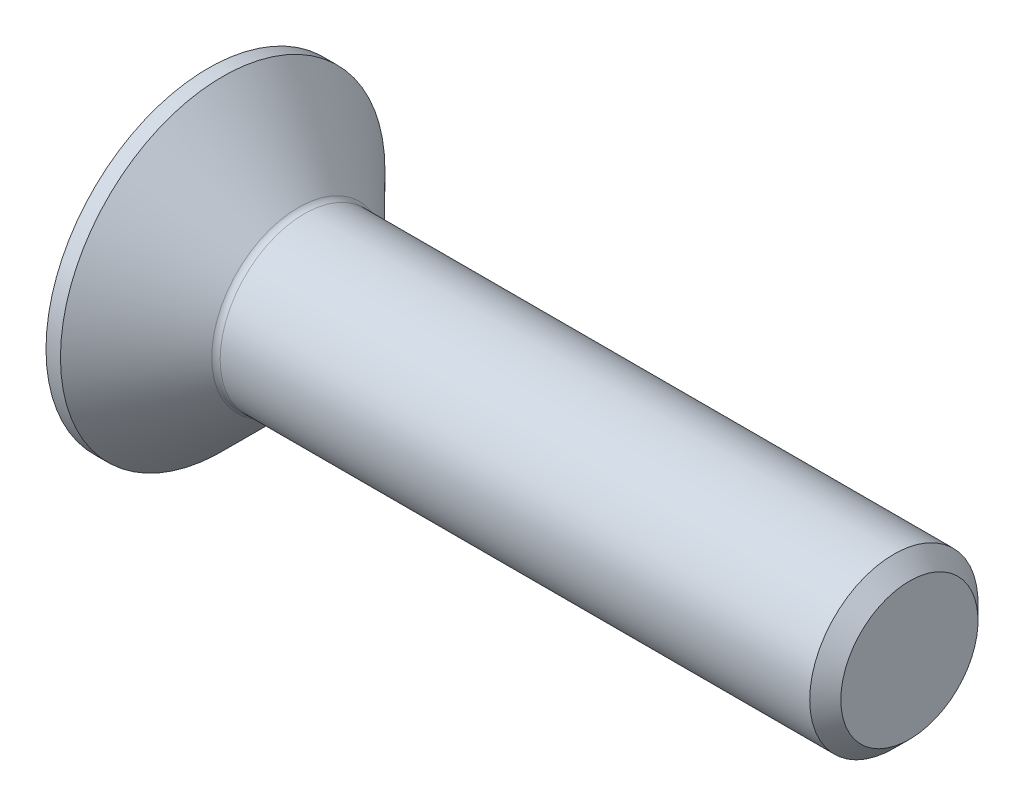
ISO-10303-21;
HEADER;
FILE_DESCRIPTION(('STEP AP214'),'2;1');
FILE_NAME('part.step','',(''),(''),'','','');
FILE_SCHEMA(('AUTOMOTIVE_DESIGN { 1 0 10303 214 1 1 1 1 }'));
ENDSEC;
DATA;
#1=APPLICATION_CONTEXT('core data for automotive mechanical design processes');
#2=APPLICATION_PROTOCOL_DEFINITION('international standard','automotive_design',2000,#1);
#3=PRODUCT_CONTEXT('',#1,'mechanical');
#4=PRODUCT('Part','Part','',(#3));
#5=PRODUCT_RELATED_PRODUCT_CATEGORY('part','',(#4));
#6=PRODUCT_DEFINITION_FORMATION('','',#4);
#7=PRODUCT_DEFINITION_CONTEXT('part definition',#1,'design');
#8=PRODUCT_DEFINITION('design','',#6,#7);
#9=PRODUCT_DEFINITION_SHAPE('','',#8);
#10=(LENGTH_UNIT() NAMED_UNIT(*) SI_UNIT(.MILLI.,.METRE.));
#11=(NAMED_UNIT(*) PLANE_ANGLE_UNIT() SI_UNIT($,.RADIAN.));
#12=(NAMED_UNIT(*) SI_UNIT($,.STERADIAN.) SOLID_ANGLE_UNIT());
#13=UNCERTAINTY_MEASURE_WITH_UNIT(LENGTH_MEASURE(1.E-05),#10,'distance_accuracy_value','');
#14=(GEOMETRIC_REPRESENTATION_CONTEXT(3) GLOBAL_UNCERTAINTY_ASSIGNED_CONTEXT((#13)) GLOBAL_UNIT_ASSIGNED_CONTEXT((#10,
#11,#12)) REPRESENTATION_CONTEXT('',''));
#15=CARTESIAN_POINT('',(0.,0.,0.));
#16=DIRECTION('',(0.,0.,1.));
#17=DIRECTION('',(1.,0.,0.));
#18=AXIS2_PLACEMENT_3D('',#15,#16,#17);
#19=CARTESIAN_POINT('',(0.,0.,0.));
#20=DIRECTION('',(-1.,0.,0.));
#21=DIRECTION('',(0.,0.,1.));
#22=AXIS2_PLACEMENT_3D('',#19,#20,#21);
#23=PLANE('',#22);
#24=CARTESIAN_POINT('',(0.,0.,0.));
#25=DIRECTION('',(-1.,0.,0.));
#26=DIRECTION('',(0.,0.,1.));
#27=AXIS2_PLACEMENT_3D('',#24,#25,#26);
#28=CIRCLE('',#27,5.785);
#29=CARTESIAN_POINT('',(0.,0.,5.785));
#30=VERTEX_POINT('',#29);
#31=EDGE_CURVE('E158',#30,#30,#28,.T.);
#32=ORIENTED_EDGE('',*,*,#31,.T.);
#33=EDGE_LOOP('',(#32));
#34=FACE_BOUND('',#33,.T.);
#35=DIRECTION('',(0.,-0.5,-0.866025403784439));
#36=VECTOR('',#35,1.);
#37=CARTESIAN_POINT('',(0.,-1.16047404107115,2.01));
#38=LINE('',#37,#36);
#39=CARTESIAN_POINT('',(0.,-1.16047404107115,2.01));
#40=VERTEX_POINT('',#39);
#41=CARTESIAN_POINT('',(0.,-2.32094808214229,0.));
#42=VERTEX_POINT('',#41);
#43=EDGE_CURVE('E120',#40,#42,#38,.T.);
#44=ORIENTED_EDGE('',*,*,#43,.T.);
#45=DIRECTION('',(0.,0.5,-0.866025403784439));
#46=VECTOR('',#45,1.);
#47=CARTESIAN_POINT('',(0.,-2.32094808214229,0.));
#48=LINE('',#47,#46);
#49=CARTESIAN_POINT('',(0.,-1.16047404107115,-2.01));
#50=VERTEX_POINT('',#49);
#51=EDGE_CURVE('E50',#42,#50,#48,.T.);
#52=ORIENTED_EDGE('',*,*,#51,.T.);
#53=DIRECTION('',(0.,1.,0.));
#54=VECTOR('',#53,1.);
#55=CARTESIAN_POINT('',(0.,-1.16047404107115,-2.01));
#56=LINE('',#55,#54);
#57=CARTESIAN_POINT('',(0.,1.16047404107115,-2.01));
#58=VERTEX_POINT('',#57);
#59=EDGE_CURVE('E135',#50,#58,#56,.T.);
#60=ORIENTED_EDGE('',*,*,#59,.T.);
#61=DIRECTION('',(0.,0.5,0.866025403784439));
#62=VECTOR('',#61,1.);
#63=CARTESIAN_POINT('',(0.,1.16047404107115,-2.01));
#64=LINE('',#63,#62);
#65=CARTESIAN_POINT('',(0.,2.32094808214229,0.));
#66=VERTEX_POINT('',#65);
#67=EDGE_CURVE('E271',#58,#66,#64,.T.);
#68=ORIENTED_EDGE('',*,*,#67,.T.);
#69=DIRECTION('',(0.,-0.5,0.866025403784439));
#70=VECTOR('',#69,1.);
#71=CARTESIAN_POINT('',(0.,2.32094808214229,0.));
#72=LINE('',#71,#70);
#73=CARTESIAN_POINT('',(0.,1.16047404107115,2.01));
#74=VERTEX_POINT('',#73);
#75=EDGE_CURVE('E274',#66,#74,#72,.T.);
#76=ORIENTED_EDGE('',*,*,#75,.T.);
#77=DIRECTION('',(0.,-1.,0.));
#78=VECTOR('',#77,1.);
#79=CARTESIAN_POINT('',(0.,1.16047404107115,2.01));
#80=LINE('',#79,#78);
#81=EDGE_CURVE('E277',#74,#40,#80,.T.);
#82=ORIENTED_EDGE('',*,*,#81,.T.);
#83=EDGE_LOOP('',(#44,#52,#60,#68,#76,#82));
#84=FACE_BOUND('',#83,.T.);
#85=ADVANCED_FACE('F35',(#34,#84),#23,.T.);
#86=CARTESIAN_POINT('',(0.,0.,0.));
#87=DIRECTION('',(-1.,0.,0.));
#88=DIRECTION('',(0.,0.,1.));
#89=AXIS2_PLACEMENT_3D('',#86,#87,#88);
#90=CYLINDRICAL_SURFACE('',#89,5.785);
#91=CARTESIAN_POINT('',(0.51500000000001,0.,0.));
#92=DIRECTION('',(-1.,0.,0.));
#93=DIRECTION('',(0.,0.,1.));
#94=AXIS2_PLACEMENT_3D('',#91,#92,#93);
#95=CIRCLE('',#94,5.785);
#96=CARTESIAN_POINT('',(0.51500000000001,0.,5.785));
#97=VERTEX_POINT('',#96);
#98=EDGE_CURVE('E155',#97,#97,#95,.T.);
#99=ORIENTED_EDGE('',*,*,#98,.T.);
#100=EDGE_LOOP('',(#99));
#101=FACE_BOUND('',#100,.T.);
#102=ORIENTED_EDGE('',*,*,#31,.F.);
#103=EDGE_LOOP('',(#102));
#104=FACE_BOUND('',#103,.T.);
#105=ADVANCED_FACE('F179',(#101,#104),#90,.T.);
#106=CARTESIAN_POINT('',(0.51500000000001,0.,0.));
#107=DIRECTION('',(-1.,0.,0.));
#108=DIRECTION('',(0.,0.,1.));
#109=AXIS2_PLACEMENT_3D('',#106,#107,#108);
#110=CONICAL_SURFACE('',#109,5.785,0.78539816339745);
#111=CARTESIAN_POINT('',(3.21213203435599,0.,0.));
#112=DIRECTION('',(-1.,0.,0.));
#113=DIRECTION('',(0.,0.,1.));
#114=AXIS2_PLACEMENT_3D('',#111,#112,#113);
#115=CIRCLE('',#114,3.08786796564401);
#116=CARTESIAN_POINT('',(3.21213203435599,0.,3.08786796564401));
#117=VERTEX_POINT('',#116);
#118=EDGE_CURVE('E43',#117,#117,#115,.T.);
#119=ORIENTED_EDGE('',*,*,#118,.T.);
#120=EDGE_LOOP('',(#119));
#121=FACE_BOUND('',#120,.T.);
#122=ORIENTED_EDGE('',*,*,#98,.F.);
#123=EDGE_LOOP('',(#122));
#124=FACE_BOUND('',#123,.T.);
#125=ADVANCED_FACE('F163',(#121,#124),#110,.T.);
#126=CARTESIAN_POINT('',(0.,0.,0.));
#127=DIRECTION('',(-1.,0.,0.));
#128=DIRECTION('',(0.,0.,1.));
#129=AXIS2_PLACEMENT_3D('',#126,#127,#128);
#130=CYLINDRICAL_SURFACE('',#129,2.99999999999997);
#131=CARTESIAN_POINT('',(3.42426406871195,0.,0.));
#132=DIRECTION('',(-1.,0.,0.));
#133=DIRECTION('',(0.,0.,1.));
#134=AXIS2_PLACEMENT_3D('',#131,#132,#133);
#135=CIRCLE('',#134,2.99999999999997);
#136=CARTESIAN_POINT('',(3.42426406871195,0.,2.99999999999997));
#137=VERTEX_POINT('',#136);
#138=EDGE_CURVE('E11',#137,#137,#135,.F.);
#139=ORIENTED_EDGE('',*,*,#138,.T.);
#140=EDGE_LOOP('',(#139));
#141=FACE_BOUND('',#140,.T.);
#142=CARTESIAN_POINT('',(24.4455,0.,0.));
#143=DIRECTION('',(-1.,0.,0.));
#144=DIRECTION('',(0.,0.,1.));
#145=AXIS2_PLACEMENT_3D('',#142,#143,#144);
#146=CIRCLE('',#145,2.99999999999995);
#147=CARTESIAN_POINT('',(24.4455,0.,2.99999999999995));
#148=VERTEX_POINT('',#147);
#149=EDGE_CURVE('E152',#148,#148,#146,.T.);
#150=ORIENTED_EDGE('',*,*,#149,.T.);
#151=EDGE_LOOP('',(#150));
#152=FACE_BOUND('',#151,.T.);
#153=ADVANCED_FACE('F190',(#141,#152),#130,.T.);
#154=CARTESIAN_POINT('',(25.,0.,0.));
#155=DIRECTION('',(-1.,0.,0.));
#156=DIRECTION('',(0.,0.,1.));
#157=AXIS2_PLACEMENT_3D('',#154,#155,#156);
#158=CONICAL_SURFACE('',#157,2.4455,0.785398163397361);
#159=ORIENTED_EDGE('',*,*,#149,.F.);
#160=EDGE_LOOP('',(#159));
#161=FACE_BOUND('',#160,.T.);
#162=CARTESIAN_POINT('',(25.,0.,0.));
#163=DIRECTION('',(-1.,0.,0.));
#164=DIRECTION('',(0.,0.,1.));
#165=AXIS2_PLACEMENT_3D('',#162,#163,#164);
#166=CIRCLE('',#165,2.4455);
#167=CARTESIAN_POINT('',(25.,0.,2.4455));
#168=VERTEX_POINT('',#167);
#169=EDGE_CURVE('E148',#168,#168,#166,.T.);
#170=ORIENTED_EDGE('',*,*,#169,.T.);
#171=EDGE_LOOP('',(#170));
#172=FACE_BOUND('',#171,.T.);
#173=ADVANCED_FACE('F174',(#161,#172),#158,.T.);
#174=CARTESIAN_POINT('',(25.,2.4455,0.));
#175=DIRECTION('',(1.,0.,0.));
#176=DIRECTION('',(0.,0.,-1.));
#177=AXIS2_PLACEMENT_3D('',#174,#175,#176);
#178=PLANE('',#177);
#179=ORIENTED_EDGE('',*,*,#169,.F.);
#180=EDGE_LOOP('',(#179));
#181=FACE_BOUND('',#180,.T.);
#182=ADVANCED_FACE('F167',(#181),#178,.T.);
#183=CARTESIAN_POINT('',(3.42426406871195,0.,0.));
#184=DIRECTION('',(-1.,0.,0.));
#185=DIRECTION('',(0.,0.,1.));
#186=AXIS2_PLACEMENT_3D('',#183,#184,#185);
#187=TOROIDAL_SURFACE('',#186,3.29999999999997,0.3);
#188=ORIENTED_EDGE('',*,*,#138,.F.);
#189=EDGE_LOOP('',(#188));
#190=FACE_BOUND('',#189,.T.);
#191=ORIENTED_EDGE('',*,*,#118,.F.);
#192=EDGE_LOOP('',(#191));
#193=FACE_BOUND('',#192,.T.);
#194=ADVANCED_FACE('F37',(#190,#193),#187,.F.);
#195=CARTESIAN_POINT('',(2.5,-2.32094808214229,0.));
#196=DIRECTION('',(0.,0.866025403784439,0.5));
#197=DIRECTION('',(0.,-0.5,0.866025403784439));
#198=AXIS2_PLACEMENT_3D('',#195,#196,#197);
#199=PLANE('',#198);
#200=ORIENTED_EDGE('',*,*,#51,.F.);
#201=DIRECTION('',(-1.,0.,0.));
#202=VECTOR('',#201,1.);
#203=CARTESIAN_POINT('',(2.5,-2.32094808214229,0.));
#204=LINE('',#203,#202);
#205=CARTESIAN_POINT('',(2.5,-2.32094808214229,0.));
#206=VERTEX_POINT('',#205);
#207=EDGE_CURVE('E268',#206,#42,#204,.T.);
#208=ORIENTED_EDGE('',*,*,#207,.F.);
#209=DIRECTION('',(0.,0.5,-0.866025403784439));
#210=VECTOR('',#209,1.);
#211=CARTESIAN_POINT('',(2.5,-2.32094808214229,0.));
#212=LINE('',#211,#210);
#213=CARTESIAN_POINT('',(2.5,-1.74071106160672,-1.005));
#214=VERTEX_POINT('',#213);
#215=EDGE_CURVE('E117',#206,#214,#212,.T.);
#216=ORIENTED_EDGE('',*,*,#215,.T.);
#217=CARTESIAN_POINT('',(2.5,-1.16047404107115,-2.01));
#218=VERTEX_POINT('',#217);
#219=EDGE_CURVE('E111',#214,#218,#212,.T.);
#220=ORIENTED_EDGE('',*,*,#219,.T.);
#221=DIRECTION('',(-1.,0.,0.));
#222=VECTOR('',#221,1.);
#223=CARTESIAN_POINT('',(2.5,-1.16047404107115,-2.01));
#224=LINE('',#223,#222);
#225=EDGE_CURVE('E115',#218,#50,#224,.T.);
#226=ORIENTED_EDGE('',*,*,#225,.T.);
#227=EDGE_LOOP('',(#200,#208,#216,#220,#226));
#228=FACE_BOUND('',#227,.T.);
#229=ADVANCED_FACE('F113',(#228),#199,.T.);
#230=CARTESIAN_POINT('',(2.5,-1.16047404107115,-2.01));
#231=DIRECTION('',(0.,0.,1.));
#232=DIRECTION('',(1.,0.,0.));
#233=AXIS2_PLACEMENT_3D('',#230,#231,#232);
#234=PLANE('',#233);
#235=ORIENTED_EDGE('',*,*,#59,.F.);
#236=ORIENTED_EDGE('',*,*,#225,.F.);
#237=DIRECTION('',(0.,1.,0.));
#238=VECTOR('',#237,1.);
#239=CARTESIAN_POINT('',(2.5,-1.16047404107115,-2.01));
#240=LINE('',#239,#238);
#241=CARTESIAN_POINT('',(2.5,0.,-2.01));
#242=VERTEX_POINT('',#241);
#243=EDGE_CURVE('E123',#218,#242,#240,.T.);
#244=ORIENTED_EDGE('',*,*,#243,.T.);
#245=CARTESIAN_POINT('',(2.5,1.16047404107115,-2.01));
#246=VERTEX_POINT('',#245);
#247=EDGE_CURVE('E130',#242,#246,#240,.T.);
#248=ORIENTED_EDGE('',*,*,#247,.T.);
#249=DIRECTION('',(-1.,0.,0.));
#250=VECTOR('',#249,1.);
#251=CARTESIAN_POINT('',(2.5,1.16047404107115,-2.01));
#252=LINE('',#251,#250);
#253=EDGE_CURVE('E137',#246,#58,#252,.T.);
#254=ORIENTED_EDGE('',*,*,#253,.T.);
#255=EDGE_LOOP('',(#235,#236,#244,#248,#254));
#256=FACE_BOUND('',#255,.T.);
#257=ADVANCED_FACE('F132',(#256),#234,.T.);
#258=CARTESIAN_POINT('',(2.5,1.16047404107115,-2.01));
#259=DIRECTION('',(0.,-0.866025403784439,0.5));
#260=DIRECTION('',(0.,-0.5,-0.866025403784439));
#261=AXIS2_PLACEMENT_3D('',#258,#259,#260);
#262=PLANE('',#261);
#263=ORIENTED_EDGE('',*,*,#67,.F.);
#264=ORIENTED_EDGE('',*,*,#253,.F.);
#265=DIRECTION('',(0.,0.5,0.866025403784439));
#266=VECTOR('',#265,1.);
#267=CARTESIAN_POINT('',(2.5,1.16047404107115,-2.01));
#268=LINE('',#267,#266);
#269=CARTESIAN_POINT('',(2.5,1.74071106160672,-1.005));
#270=VERTEX_POINT('',#269);
#271=EDGE_CURVE('E260',#246,#270,#268,.T.);
#272=ORIENTED_EDGE('',*,*,#271,.T.);
#273=CARTESIAN_POINT('',(2.5,2.32094808214229,0.));
#274=VERTEX_POINT('',#273);
#275=EDGE_CURVE('E129',#270,#274,#268,.T.);
#276=ORIENTED_EDGE('',*,*,#275,.T.);
#277=DIRECTION('',(-1.,0.,0.));
#278=VECTOR('',#277,1.);
#279=CARTESIAN_POINT('',(2.5,2.32094808214229,0.));
#280=LINE('',#279,#278);
#281=EDGE_CURVE('E143',#274,#66,#280,.T.);
#282=ORIENTED_EDGE('',*,*,#281,.T.);
#283=EDGE_LOOP('',(#263,#264,#272,#276,#282));
#284=FACE_BOUND('',#283,.T.);
#285=ADVANCED_FACE('F204',(#284),#262,.T.);
#286=CARTESIAN_POINT('',(2.5,2.32094808214229,0.));
#287=DIRECTION('',(0.,-0.866025403784439,-0.5));
#288=DIRECTION('',(0.,0.5,-0.866025403784439));
#289=AXIS2_PLACEMENT_3D('',#286,#287,#288);
#290=PLANE('',#289);
#291=ORIENTED_EDGE('',*,*,#75,.F.);
#292=ORIENTED_EDGE('',*,*,#281,.F.);
#293=DIRECTION('',(0.,-0.5,0.866025403784439));
#294=VECTOR('',#293,1.);
#295=CARTESIAN_POINT('',(2.5,2.32094808214229,0.));
#296=LINE('',#295,#294);
#297=CARTESIAN_POINT('',(2.5,1.74071106160672,1.005));
#298=VERTEX_POINT('',#297);
#299=EDGE_CURVE('E58',#274,#298,#296,.T.);
#300=ORIENTED_EDGE('',*,*,#299,.T.);
#301=CARTESIAN_POINT('',(2.5,1.16047404107115,2.01));
#302=VERTEX_POINT('',#301);
#303=EDGE_CURVE('E239',#298,#302,#296,.T.);
#304=ORIENTED_EDGE('',*,*,#303,.T.);
#305=DIRECTION('',(-1.,0.,0.));
#306=VECTOR('',#305,1.);
#307=CARTESIAN_POINT('',(2.5,1.16047404107115,2.01));
#308=LINE('',#307,#306);
#309=EDGE_CURVE('E253',#302,#74,#308,.T.);
#310=ORIENTED_EDGE('',*,*,#309,.T.);
#311=EDGE_LOOP('',(#291,#292,#300,#304,#310));
#312=FACE_BOUND('',#311,.T.);
#313=ADVANCED_FACE('F207',(#312),#290,.T.);
#314=CARTESIAN_POINT('',(2.5,1.16047404107115,2.01));
#315=DIRECTION('',(0.,0.,-1.));
#316=DIRECTION('',(-1.,0.,0.));
#317=AXIS2_PLACEMENT_3D('',#314,#315,#316);
#318=PLANE('',#317);
#319=ORIENTED_EDGE('',*,*,#81,.F.);
#320=ORIENTED_EDGE('',*,*,#309,.F.);
#321=DIRECTION('',(0.,-1.,0.));
#322=VECTOR('',#321,1.);
#323=CARTESIAN_POINT('',(2.5,1.16047404107115,2.01));
#324=LINE('',#323,#322);
#325=CARTESIAN_POINT('',(2.5,0.,2.01));
#326=VERTEX_POINT('',#325);
#327=EDGE_CURVE('E238',#302,#326,#324,.T.);
#328=ORIENTED_EDGE('',*,*,#327,.T.);
#329=CARTESIAN_POINT('',(2.5,-1.16047404107115,2.01));
#330=VERTEX_POINT('',#329);
#331=EDGE_CURVE('E244',#326,#330,#324,.T.);
#332=ORIENTED_EDGE('',*,*,#331,.T.);
#333=DIRECTION('',(-1.,0.,0.));
#334=VECTOR('',#333,1.);
#335=CARTESIAN_POINT('',(2.5,-1.16047404107115,2.01));
#336=LINE('',#335,#334);
#337=EDGE_CURVE('E283',#330,#40,#336,.T.);
#338=ORIENTED_EDGE('',*,*,#337,.T.);
#339=EDGE_LOOP('',(#319,#320,#328,#332,#338));
#340=FACE_BOUND('',#339,.T.);
#341=ADVANCED_FACE('F211',(#340),#318,.T.);
#342=CARTESIAN_POINT('',(2.5,-1.16047404107115,2.01));
#343=DIRECTION('',(0.,0.866025403784439,-0.5));
#344=DIRECTION('',(0.,0.5,0.866025403784439));
#345=AXIS2_PLACEMENT_3D('',#342,#343,#344);
#346=PLANE('',#345);
#347=ORIENTED_EDGE('',*,*,#43,.F.);
#348=ORIENTED_EDGE('',*,*,#337,.F.);
#349=DIRECTION('',(0.,-0.5,-0.866025403784439));
#350=VECTOR('',#349,1.);
#351=CARTESIAN_POINT('',(2.5,-1.16047404107115,2.01));
#352=LINE('',#351,#350);
#353=CARTESIAN_POINT('',(2.5,-1.74071106160672,1.005));
#354=VERTEX_POINT('',#353);
#355=EDGE_CURVE('E247',#330,#354,#352,.T.);
#356=ORIENTED_EDGE('',*,*,#355,.T.);
#357=EDGE_CURVE('E254',#354,#206,#352,.T.);
#358=ORIENTED_EDGE('',*,*,#357,.T.);
#359=ORIENTED_EDGE('',*,*,#207,.T.);
#360=EDGE_LOOP('',(#347,#348,#356,#358,#359));
#361=FACE_BOUND('',#360,.T.);
#362=ADVANCED_FACE('F214',(#361),#346,.T.);
#363=CARTESIAN_POINT('',(2.5,-2.32094808214229,0.));
#364=DIRECTION('',(-1.,0.,0.));
#365=DIRECTION('',(0.,0.,1.));
#366=AXIS2_PLACEMENT_3D('',#363,#364,#365);
#367=PLANE('',#366);
#368=CARTESIAN_POINT('',(2.5,0.,0.));
#369=DIRECTION('',(-1.,0.,0.));
#370=DIRECTION('',(0.,0.,1.));
#371=AXIS2_PLACEMENT_3D('',#368,#369,#370);
#372=CIRCLE('',#371,2.01);
#373=EDGE_CURVE('E136',#354,#326,#372,.T.);
#374=ORIENTED_EDGE('',*,*,#373,.F.);
#375=ORIENTED_EDGE('',*,*,#355,.F.);
#376=ORIENTED_EDGE('',*,*,#331,.F.);
#377=EDGE_LOOP('',(#374,#375,#376));
#378=FACE_BOUND('',#377,.T.);
#379=ADVANCED_FACE('F218',(#378),#367,.T.);
#380=EDGE_CURVE('E140',#214,#354,#372,.T.);
#381=ORIENTED_EDGE('',*,*,#380,.F.);
#382=ORIENTED_EDGE('',*,*,#215,.F.);
#383=ORIENTED_EDGE('',*,*,#357,.F.);
#384=EDGE_LOOP('',(#381,#382,#383));
#385=FACE_BOUND('',#384,.T.);
#386=ADVANCED_FACE('F221',(#385),#367,.T.);
#387=EDGE_CURVE('E125',#242,#214,#372,.T.);
#388=ORIENTED_EDGE('',*,*,#387,.F.);
#389=ORIENTED_EDGE('',*,*,#243,.F.);
#390=ORIENTED_EDGE('',*,*,#219,.F.);
#391=EDGE_LOOP('',(#388,#389,#390));
#392=FACE_BOUND('',#391,.T.);
#393=ADVANCED_FACE('F124',(#392),#367,.T.);
#394=EDGE_CURVE('E256',#270,#242,#372,.T.);
#395=ORIENTED_EDGE('',*,*,#394,.F.);
#396=ORIENTED_EDGE('',*,*,#271,.F.);
#397=ORIENTED_EDGE('',*,*,#247,.F.);
#398=EDGE_LOOP('',(#395,#396,#397));
#399=FACE_BOUND('',#398,.T.);
#400=ADVANCED_FACE('F233',(#399),#367,.T.);
#401=EDGE_CURVE('E149',#298,#270,#372,.T.);
#402=ORIENTED_EDGE('',*,*,#401,.F.);
#403=ORIENTED_EDGE('',*,*,#299,.F.);
#404=ORIENTED_EDGE('',*,*,#275,.F.);
#405=EDGE_LOOP('',(#402,#403,#404));
#406=FACE_BOUND('',#405,.T.);
#407=ADVANCED_FACE('F228',(#406),#367,.T.);
#408=EDGE_CURVE('E142',#326,#298,#372,.T.);
#409=ORIENTED_EDGE('',*,*,#408,.F.);
#410=ORIENTED_EDGE('',*,*,#327,.F.);
#411=ORIENTED_EDGE('',*,*,#303,.F.);
#412=EDGE_LOOP('',(#409,#410,#411));
#413=FACE_BOUND('',#412,.T.);
#414=ADVANCED_FACE('F199',(#413),#367,.T.);
#415=CARTESIAN_POINT('',(2.5,0.,0.));
#416=DIRECTION('',(-1.,0.,0.));
#417=DIRECTION('',(0.,0.,1.));
#418=AXIS2_PLACEMENT_3D('',#415,#416,#417);
#419=CONICAL_SURFACE('',#418,2.01,1.04719755119659);
#420=CARTESIAN_POINT('',(3.66047404107116,0.,0.));
#421=VERTEX_POINT('',#420);
#422=VERTEX_LOOP('',#421);
#423=FACE_BOUND('',#422,.T.);
#424=ORIENTED_EDGE('',*,*,#408,.T.);
#425=ORIENTED_EDGE('',*,*,#401,.T.);
#426=ORIENTED_EDGE('',*,*,#394,.T.);
#427=ORIENTED_EDGE('',*,*,#387,.T.);
#428=ORIENTED_EDGE('',*,*,#380,.T.);
#429=ORIENTED_EDGE('',*,*,#373,.T.);
#430=EDGE_LOOP('',(#424,#425,#426,#427,#428,#429));
#431=FACE_BOUND('',#430,.T.);
#432=ADVANCED_FACE('F197',(#423,#431),#419,.F.);
#433=CLOSED_SHELL('',(#85,#105,#125,#153,#173,#182,#194,#229,#257,#285,#313,#341,#362,#379,#386,
#393,#400,#407,#414,#432));
#434=MANIFOLD_SOLID_BREP('B2',#433);
#435=ADVANCED_BREP_SHAPE_REPRESENTATION('',(#18,#434),#14);
#436=SHAPE_DEFINITION_REPRESENTATION(#9,#435);
ENDSEC;
END-ISO-10303-21;
